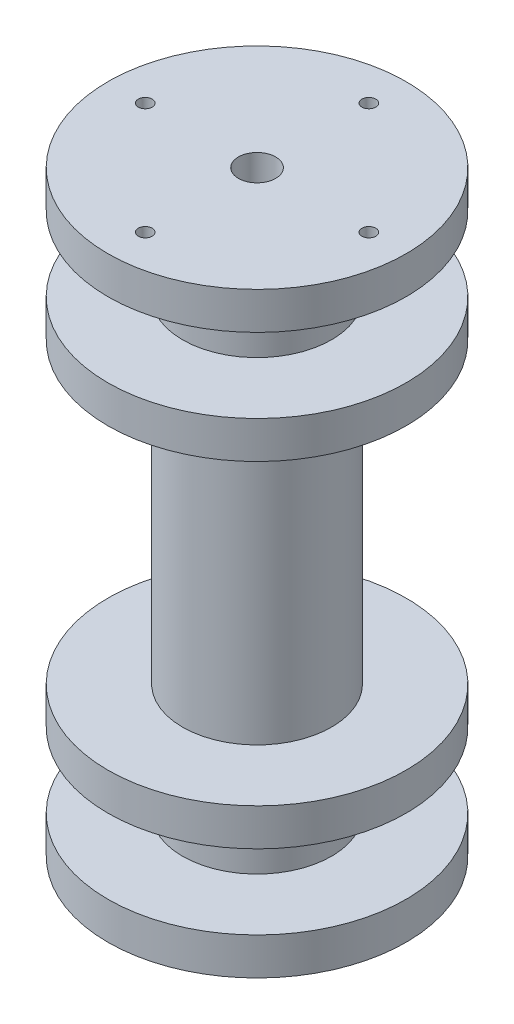
ISO-10303-21;
HEADER;
FILE_DESCRIPTION(('STEP AP214'),'2;1');
FILE_NAME('part.step','',(''),(''),'','','');
FILE_SCHEMA(('AUTOMOTIVE_DESIGN { 1 0 10303 214 1 1 1 1 }'));
ENDSEC;
DATA;
#1=APPLICATION_CONTEXT('core data for automotive mechanical design processes');
#2=APPLICATION_PROTOCOL_DEFINITION('international standard','automotive_design',2000,#1);
#3=PRODUCT_CONTEXT('',#1,'mechanical');
#4=PRODUCT('Part','Part','',(#3));
#5=PRODUCT_RELATED_PRODUCT_CATEGORY('part','',(#4));
#6=PRODUCT_DEFINITION_FORMATION('','',#4);
#7=PRODUCT_DEFINITION_CONTEXT('part definition',#1,'design');
#8=PRODUCT_DEFINITION('design','',#6,#7);
#9=PRODUCT_DEFINITION_SHAPE('','',#8);
#10=(LENGTH_UNIT() NAMED_UNIT(*) SI_UNIT(.MILLI.,.METRE.));
#11=(NAMED_UNIT(*) PLANE_ANGLE_UNIT() SI_UNIT($,.RADIAN.));
#12=(NAMED_UNIT(*) SI_UNIT($,.STERADIAN.) SOLID_ANGLE_UNIT());
#13=UNCERTAINTY_MEASURE_WITH_UNIT(LENGTH_MEASURE(1.E-05),#10,'distance_accuracy_value','');
#14=(GEOMETRIC_REPRESENTATION_CONTEXT(3) GLOBAL_UNCERTAINTY_ASSIGNED_CONTEXT((#13)) GLOBAL_UNIT_ASSIGNED_CONTEXT((#10,
#11,#12)) REPRESENTATION_CONTEXT('',''));
#15=CARTESIAN_POINT('',(0.,0.,0.));
#16=DIRECTION('',(0.,0.,1.));
#17=DIRECTION('',(1.,0.,0.));
#18=AXIS2_PLACEMENT_3D('',#15,#16,#17);
#19=CARTESIAN_POINT('',(0.,101.6,0.));
#20=DIRECTION('',(0.,-1.,0.));
#21=DIRECTION('',(0.,0.,-1.));
#22=AXIS2_PLACEMENT_3D('',#19,#20,#21);
#23=CYLINDRICAL_SURFACE('',#22,25.4);
#24=CARTESIAN_POINT('',(0.,19.05,0.));
#25=DIRECTION('',(0.,1.,0.));
#26=DIRECTION('',(0.,0.,1.));
#27=AXIS2_PLACEMENT_3D('',#24,#25,#26);
#28=CIRCLE('',#27,25.4);
#29=CARTESIAN_POINT('',(0.,19.05,25.4));
#30=VERTEX_POINT('',#29);
#31=EDGE_CURVE('E63',#30,#30,#28,.T.);
#32=ORIENTED_EDGE('',*,*,#31,.T.);
#33=EDGE_LOOP('',(#32));
#34=FACE_BOUND('',#33,.T.);
#35=CARTESIAN_POINT('',(0.,25.4,0.));
#36=DIRECTION('',(0.,1.,0.));
#37=DIRECTION('',(0.,0.,1.));
#38=AXIS2_PLACEMENT_3D('',#35,#36,#37);
#39=CIRCLE('',#38,25.4);
#40=CARTESIAN_POINT('',(0.,25.4,25.4));
#41=VERTEX_POINT('',#40);
#42=EDGE_CURVE('E66',#41,#41,#39,.T.);
#43=ORIENTED_EDGE('',*,*,#42,.F.);
#44=EDGE_LOOP('',(#43));
#45=FACE_BOUND('',#44,.T.);
#46=ADVANCED_FACE('F30',(#34,#45),#23,.T.);
#47=CARTESIAN_POINT('',(0.,6.35,-25.4));
#48=DIRECTION('',(0.,1.,0.));
#49=DIRECTION('',(0.,0.,1.));
#50=AXIS2_PLACEMENT_3D('',#47,#48,#49);
#51=PLANE('',#50);
#52=CARTESIAN_POINT('',(0.,6.34999999999999,0.));
#53=DIRECTION('',(0.,1.,0.));
#54=DIRECTION('',(0.,0.,1.));
#55=AXIS2_PLACEMENT_3D('',#52,#53,#54);
#56=CIRCLE('',#55,25.4);
#57=CARTESIAN_POINT('',(0.,6.34999999999999,25.4));
#58=VERTEX_POINT('',#57);
#59=EDGE_CURVE('E54',#58,#58,#56,.T.);
#60=ORIENTED_EDGE('',*,*,#59,.T.);
#61=EDGE_LOOP('',(#60));
#62=FACE_BOUND('',#61,.T.);
#63=CARTESIAN_POINT('',(0.,6.34999999999999,0.));
#64=DIRECTION('',(0.,1.,0.));
#65=DIRECTION('',(0.,0.,1.));
#66=AXIS2_PLACEMENT_3D('',#63,#64,#65);
#67=CIRCLE('',#66,12.7);
#68=CARTESIAN_POINT('',(0.,6.34999999999999,12.7));
#69=VERTEX_POINT('',#68);
#70=EDGE_CURVE('E57',#69,#69,#67,.T.);
#71=ORIENTED_EDGE('',*,*,#70,.F.);
#72=EDGE_LOOP('',(#71));
#73=FACE_BOUND('',#72,.T.);
#74=ADVANCED_FACE('F152',(#62,#73),#51,.T.);
#75=CARTESIAN_POINT('',(0.,101.6,0.));
#76=DIRECTION('',(0.,1.,0.));
#77=DIRECTION('',(0.,0.,1.));
#78=AXIS2_PLACEMENT_3D('',#75,#76,#77);
#79=CYLINDRICAL_SURFACE('',#78,12.7);
#80=ORIENTED_EDGE('',*,*,#70,.T.);
#81=EDGE_LOOP('',(#80));
#82=FACE_BOUND('',#81,.T.);
#83=CARTESIAN_POINT('',(0.,19.05,0.));
#84=DIRECTION('',(0.,1.,0.));
#85=DIRECTION('',(0.,0.,1.));
#86=AXIS2_PLACEMENT_3D('',#83,#84,#85);
#87=CIRCLE('',#86,12.7);
#88=CARTESIAN_POINT('',(0.,19.05,12.7));
#89=VERTEX_POINT('',#88);
#90=EDGE_CURVE('E60',#89,#89,#87,.T.);
#91=ORIENTED_EDGE('',*,*,#90,.F.);
#92=EDGE_LOOP('',(#91));
#93=FACE_BOUND('',#92,.T.);
#94=ADVANCED_FACE('F155',(#82,#93),#79,.T.);
#95=CARTESIAN_POINT('',(0.,19.05,-25.4));
#96=DIRECTION('',(0.,-1.,0.));
#97=DIRECTION('',(0.,0.,-1.));
#98=AXIS2_PLACEMENT_3D('',#95,#96,#97);
#99=PLANE('',#98);
#100=ORIENTED_EDGE('',*,*,#90,.T.);
#101=EDGE_LOOP('',(#100));
#102=FACE_BOUND('',#101,.T.);
#103=ORIENTED_EDGE('',*,*,#31,.F.);
#104=EDGE_LOOP('',(#103));
#105=FACE_BOUND('',#104,.T.);
#106=ADVANCED_FACE('F144',(#102,#105),#99,.T.);
#107=CARTESIAN_POINT('',(0.,0.,0.));
#108=DIRECTION('',(0.,1.,0.));
#109=DIRECTION('',(0.,0.,1.));
#110=AXIS2_PLACEMENT_3D('',#107,#108,#109);
#111=PLANE('',#110);
#112=CARTESIAN_POINT('',(0.,0.,0.));
#113=DIRECTION('',(0.,1.,0.));
#114=DIRECTION('',(0.,0.,1.));
#115=AXIS2_PLACEMENT_3D('',#112,#113,#114);
#116=CIRCLE('',#115,3.175);
#117=CARTESIAN_POINT('',(0.,0.,3.175));
#118=VERTEX_POINT('',#117);
#119=EDGE_CURVE('E78',#118,#118,#116,.F.);
#120=ORIENTED_EDGE('',*,*,#119,.F.);
#121=EDGE_LOOP('',(#120));
#122=FACE_BOUND('',#121,.T.);
#123=CARTESIAN_POINT('',(0.,0.,0.));
#124=DIRECTION('',(0.,1.,0.));
#125=DIRECTION('',(0.,0.,1.));
#126=AXIS2_PLACEMENT_3D('',#123,#124,#125);
#127=CIRCLE('',#126,25.4);
#128=CARTESIAN_POINT('',(0.,0.,25.4));
#129=VERTEX_POINT('',#128);
#130=EDGE_CURVE('E34',#129,#129,#127,.T.);
#131=ORIENTED_EDGE('',*,*,#130,.F.);
#132=EDGE_LOOP('',(#131));
#133=FACE_BOUND('',#132,.T.);
#134=ADVANCED_FACE('F141',(#122,#133),#111,.F.);
#135=ORIENTED_EDGE('',*,*,#130,.T.);
#136=EDGE_LOOP('',(#135));
#137=FACE_BOUND('',#136,.T.);
#138=ORIENTED_EDGE('',*,*,#59,.F.);
#139=EDGE_LOOP('',(#138));
#140=FACE_BOUND('',#139,.T.);
#141=ADVANCED_FACE('F32',(#137,#140),#23,.T.);
#142=CARTESIAN_POINT('',(0.,25.4,-25.4));
#143=DIRECTION('',(0.,1.,0.));
#144=DIRECTION('',(0.,0.,1.));
#145=AXIS2_PLACEMENT_3D('',#142,#143,#144);
#146=PLANE('',#145);
#147=ORIENTED_EDGE('',*,*,#42,.T.);
#148=EDGE_LOOP('',(#147));
#149=FACE_BOUND('',#148,.T.);
#150=CARTESIAN_POINT('',(0.,25.4,0.));
#151=DIRECTION('',(0.,1.,0.));
#152=DIRECTION('',(0.,0.,1.));
#153=AXIS2_PLACEMENT_3D('',#150,#151,#152);
#154=CIRCLE('',#153,12.7);
#155=CARTESIAN_POINT('',(0.,25.4,12.7));
#156=VERTEX_POINT('',#155);
#157=EDGE_CURVE('E69',#156,#156,#154,.T.);
#158=ORIENTED_EDGE('',*,*,#157,.F.);
#159=EDGE_LOOP('',(#158));
#160=FACE_BOUND('',#159,.T.);
#161=ADVANCED_FACE('F149',(#149,#160),#146,.T.);
#162=CARTESIAN_POINT('',(0.,101.6,0.));
#163=DIRECTION('',(0.,1.,0.));
#164=DIRECTION('',(0.,0.,1.));
#165=AXIS2_PLACEMENT_3D('',#162,#163,#164);
#166=CYLINDRICAL_SURFACE('',#165,12.7);
#167=ORIENTED_EDGE('',*,*,#157,.T.);
#168=EDGE_LOOP('',(#167));
#169=FACE_BOUND('',#168,.T.);
#170=CARTESIAN_POINT('',(0.,76.2,0.));
#171=DIRECTION('',(0.,1.,0.));
#172=DIRECTION('',(0.,0.,1.));
#173=AXIS2_PLACEMENT_3D('',#170,#171,#172);
#174=CIRCLE('',#173,12.7);
#175=CARTESIAN_POINT('',(0.,76.2,12.7));
#176=VERTEX_POINT('',#175);
#177=EDGE_CURVE('E72',#176,#176,#174,.T.);
#178=ORIENTED_EDGE('',*,*,#177,.F.);
#179=EDGE_LOOP('',(#178));
#180=FACE_BOUND('',#179,.T.);
#181=ADVANCED_FACE('F175',(#169,#180),#166,.T.);
#182=CARTESIAN_POINT('',(0.,76.2,-25.4));
#183=DIRECTION('',(0.,-1.,0.));
#184=DIRECTION('',(0.,0.,-1.));
#185=AXIS2_PLACEMENT_3D('',#182,#183,#184);
#186=PLANE('',#185);
#187=ORIENTED_EDGE('',*,*,#177,.T.);
#188=EDGE_LOOP('',(#187));
#189=FACE_BOUND('',#188,.T.);
#190=CARTESIAN_POINT('',(0.,76.2,0.));
#191=DIRECTION('',(0.,1.,0.));
#192=DIRECTION('',(0.,0.,1.));
#193=AXIS2_PLACEMENT_3D('',#190,#191,#192);
#194=CIRCLE('',#193,25.4);
#195=CARTESIAN_POINT('',(0.,76.2,25.4));
#196=VERTEX_POINT('',#195);
#197=EDGE_CURVE('E75',#196,#196,#194,.T.);
#198=ORIENTED_EDGE('',*,*,#197,.F.);
#199=EDGE_LOOP('',(#198));
#200=FACE_BOUND('',#199,.T.);
#201=ADVANCED_FACE('F123',(#189,#200),#186,.T.);
#202=CARTESIAN_POINT('',(0.,101.6,0.));
#203=DIRECTION('',(0.,1.,0.));
#204=DIRECTION('',(0.,0.,1.));
#205=AXIS2_PLACEMENT_3D('',#202,#203,#204);
#206=PLANE('',#205);
#207=CARTESIAN_POINT('',(-1.99538158514885E-13,101.6,19.05));
#208=DIRECTION('',(0.,1.,0.));
#209=DIRECTION('',(0.,0.,1.));
#210=AXIS2_PLACEMENT_3D('',#207,#208,#209);
#211=CIRCLE('',#210,1.18745);
#212=CARTESIAN_POINT('',(-1.99538158514885E-13,101.6,20.23745));
#213=VERTEX_POINT('',#212);
#214=EDGE_CURVE('E103',#213,#213,#211,.T.);
#215=ORIENTED_EDGE('',*,*,#214,.F.);
#216=EDGE_LOOP('',(#215));
#217=FACE_BOUND('',#216,.T.);
#218=CARTESIAN_POINT('',(19.05,101.6,1.33025439009923E-13));
#219=DIRECTION('',(0.,1.,0.));
#220=DIRECTION('',(0.,0.,1.));
#221=AXIS2_PLACEMENT_3D('',#218,#219,#220);
#222=CIRCLE('',#221,1.18745);
#223=CARTESIAN_POINT('',(19.05,101.6,1.18745000000013));
#224=VERTEX_POINT('',#223);
#225=EDGE_CURVE('E97',#224,#224,#222,.T.);
#226=ORIENTED_EDGE('',*,*,#225,.F.);
#227=EDGE_LOOP('',(#226));
#228=FACE_BOUND('',#227,.T.);
#229=CARTESIAN_POINT('',(0.,101.6,-19.05));
#230=DIRECTION('',(0.,1.,0.));
#231=DIRECTION('',(0.,0.,1.));
#232=AXIS2_PLACEMENT_3D('',#229,#230,#231);
#233=CIRCLE('',#232,1.18745);
#234=CARTESIAN_POINT('',(0.,101.6,-17.86255));
#235=VERTEX_POINT('',#234);
#236=EDGE_CURVE('E91',#235,#235,#233,.T.);
#237=ORIENTED_EDGE('',*,*,#236,.F.);
#238=EDGE_LOOP('',(#237));
#239=FACE_BOUND('',#238,.T.);
#240=CARTESIAN_POINT('',(-19.05,101.6,0.));
#241=DIRECTION('',(0.,1.,0.));
#242=DIRECTION('',(0.,0.,1.));
#243=AXIS2_PLACEMENT_3D('',#240,#241,#242);
#244=CIRCLE('',#243,1.18745);
#245=CARTESIAN_POINT('',(-19.05,101.6,1.18745));
#246=VERTEX_POINT('',#245);
#247=EDGE_CURVE('E85',#246,#246,#244,.T.);
#248=ORIENTED_EDGE('',*,*,#247,.F.);
#249=EDGE_LOOP('',(#248));
#250=FACE_BOUND('',#249,.T.);
#251=CARTESIAN_POINT('',(0.,101.6,0.));
#252=DIRECTION('',(0.,1.,0.));
#253=DIRECTION('',(0.,0.,1.));
#254=AXIS2_PLACEMENT_3D('',#251,#252,#253);
#255=CIRCLE('',#254,3.175);
#256=CARTESIAN_POINT('',(0.,101.6,3.175));
#257=VERTEX_POINT('',#256);
#258=EDGE_CURVE('E81',#257,#257,#255,.T.);
#259=ORIENTED_EDGE('',*,*,#258,.F.);
#260=EDGE_LOOP('',(#259));
#261=FACE_BOUND('',#260,.T.);
#262=CARTESIAN_POINT('',(0.,101.6,0.));
#263=DIRECTION('',(0.,1.,0.));
#264=DIRECTION('',(0.,0.,1.));
#265=AXIS2_PLACEMENT_3D('',#262,#263,#264);
#266=CIRCLE('',#265,25.4);
#267=CARTESIAN_POINT('',(0.,101.6,25.4));
#268=VERTEX_POINT('',#267);
#269=EDGE_CURVE('E10',#268,#268,#266,.T.);
#270=ORIENTED_EDGE('',*,*,#269,.T.);
#271=EDGE_LOOP('',(#270));
#272=FACE_BOUND('',#271,.T.);
#273=ADVANCED_FACE('F119',(#217,#228,#239,#250,#261,#272),#206,.T.);
#274=ORIENTED_EDGE('',*,*,#269,.F.);
#275=EDGE_LOOP('',(#274));
#276=FACE_BOUND('',#275,.T.);
#277=CARTESIAN_POINT('',(0.,95.25,0.));
#278=DIRECTION('',(0.,1.,0.));
#279=DIRECTION('',(0.,0.,1.));
#280=AXIS2_PLACEMENT_3D('',#277,#278,#279);
#281=CIRCLE('',#280,25.4);
#282=CARTESIAN_POINT('',(0.,95.25,25.4));
#283=VERTEX_POINT('',#282);
#284=EDGE_CURVE('E51',#283,#283,#281,.T.);
#285=ORIENTED_EDGE('',*,*,#284,.T.);
#286=EDGE_LOOP('',(#285));
#287=FACE_BOUND('',#286,.T.);
#288=ADVANCED_FACE('F122',(#276,#287),#23,.T.);
#289=CARTESIAN_POINT('',(0.,95.25,-25.4));
#290=DIRECTION('',(0.,-1.,0.));
#291=DIRECTION('',(0.,0.,-1.));
#292=AXIS2_PLACEMENT_3D('',#289,#290,#291);
#293=PLANE('',#292);
#294=CARTESIAN_POINT('',(-1.99538158514885E-13,95.25,19.05));
#295=DIRECTION('',(0.,-1.,0.));
#296=DIRECTION('',(0.,0.,-1.));
#297=AXIS2_PLACEMENT_3D('',#294,#295,#296);
#298=CIRCLE('',#297,1.18745);
#299=CARTESIAN_POINT('',(-1.99538158514885E-13,95.25,17.86255));
#300=VERTEX_POINT('',#299);
#301=EDGE_CURVE('E100',#300,#300,#298,.F.);
#302=ORIENTED_EDGE('',*,*,#301,.T.);
#303=EDGE_LOOP('',(#302));
#304=FACE_BOUND('',#303,.T.);
#305=CARTESIAN_POINT('',(19.05,95.25,1.33025439009923E-13));
#306=DIRECTION('',(0.,-1.,0.));
#307=DIRECTION('',(0.,0.,-1.));
#308=AXIS2_PLACEMENT_3D('',#305,#306,#307);
#309=CIRCLE('',#308,1.18745);
#310=CARTESIAN_POINT('',(19.05,95.25,-1.18744999999987));
#311=VERTEX_POINT('',#310);
#312=EDGE_CURVE('E94',#311,#311,#309,.F.);
#313=ORIENTED_EDGE('',*,*,#312,.T.);
#314=EDGE_LOOP('',(#313));
#315=FACE_BOUND('',#314,.T.);
#316=CARTESIAN_POINT('',(0.,95.25,-19.05));
#317=DIRECTION('',(0.,-1.,0.));
#318=DIRECTION('',(0.,0.,-1.));
#319=AXIS2_PLACEMENT_3D('',#316,#317,#318);
#320=CIRCLE('',#319,1.18745);
#321=CARTESIAN_POINT('',(0.,95.25,-20.23745));
#322=VERTEX_POINT('',#321);
#323=EDGE_CURVE('E88',#322,#322,#320,.F.);
#324=ORIENTED_EDGE('',*,*,#323,.T.);
#325=EDGE_LOOP('',(#324));
#326=FACE_BOUND('',#325,.T.);
#327=CARTESIAN_POINT('',(-19.05,95.25,0.));
#328=DIRECTION('',(0.,-1.,0.));
#329=DIRECTION('',(0.,0.,-1.));
#330=AXIS2_PLACEMENT_3D('',#327,#328,#329);
#331=CIRCLE('',#330,1.18745);
#332=CARTESIAN_POINT('',(-19.05,95.25,-1.18745));
#333=VERTEX_POINT('',#332);
#334=EDGE_CURVE('E84',#333,#333,#331,.F.);
#335=ORIENTED_EDGE('',*,*,#334,.T.);
#336=EDGE_LOOP('',(#335));
#337=FACE_BOUND('',#336,.T.);
#338=CARTESIAN_POINT('',(0.,95.25,0.));
#339=DIRECTION('',(0.,1.,0.));
#340=DIRECTION('',(0.,0.,1.));
#341=AXIS2_PLACEMENT_3D('',#338,#339,#340);
#342=CIRCLE('',#341,12.7);
#343=CARTESIAN_POINT('',(0.,95.25,12.7));
#344=VERTEX_POINT('',#343);
#345=EDGE_CURVE('E48',#344,#344,#342,.T.);
#346=ORIENTED_EDGE('',*,*,#345,.T.);
#347=EDGE_LOOP('',(#346));
#348=FACE_BOUND('',#347,.T.);
#349=ORIENTED_EDGE('',*,*,#284,.F.);
#350=EDGE_LOOP('',(#349));
#351=FACE_BOUND('',#350,.T.);
#352=ADVANCED_FACE('F109',(#304,#315,#326,#337,#348,#351),#293,.T.);
#353=CARTESIAN_POINT('',(0.,101.6,0.));
#354=DIRECTION('',(0.,1.,0.));
#355=DIRECTION('',(0.,0.,1.));
#356=AXIS2_PLACEMENT_3D('',#353,#354,#355);
#357=CYLINDRICAL_SURFACE('',#356,12.7);
#358=CARTESIAN_POINT('',(0.,82.55,0.));
#359=DIRECTION('',(0.,1.,0.));
#360=DIRECTION('',(0.,0.,1.));
#361=AXIS2_PLACEMENT_3D('',#358,#359,#360);
#362=CIRCLE('',#361,12.7);
#363=CARTESIAN_POINT('',(0.,82.55,12.7));
#364=VERTEX_POINT('',#363);
#365=EDGE_CURVE('E45',#364,#364,#362,.T.);
#366=ORIENTED_EDGE('',*,*,#365,.T.);
#367=EDGE_LOOP('',(#366));
#368=FACE_BOUND('',#367,.T.);
#369=ORIENTED_EDGE('',*,*,#345,.F.);
#370=EDGE_LOOP('',(#369));
#371=FACE_BOUND('',#370,.T.);
#372=ADVANCED_FACE('F195',(#368,#371),#357,.T.);
#373=CARTESIAN_POINT('',(0.,82.55,-25.4));
#374=DIRECTION('',(0.,1.,0.));
#375=DIRECTION('',(0.,0.,1.));
#376=AXIS2_PLACEMENT_3D('',#373,#374,#375);
#377=PLANE('',#376);
#378=CARTESIAN_POINT('',(0.,82.55,0.));
#379=DIRECTION('',(0.,1.,0.));
#380=DIRECTION('',(0.,0.,1.));
#381=AXIS2_PLACEMENT_3D('',#378,#379,#380);
#382=CIRCLE('',#381,25.4);
#383=CARTESIAN_POINT('',(0.,82.55,25.4));
#384=VERTEX_POINT('',#383);
#385=EDGE_CURVE('E41',#384,#384,#382,.T.);
#386=ORIENTED_EDGE('',*,*,#385,.T.);
#387=EDGE_LOOP('',(#386));
#388=FACE_BOUND('',#387,.T.);
#389=ORIENTED_EDGE('',*,*,#365,.F.);
#390=EDGE_LOOP('',(#389));
#391=FACE_BOUND('',#390,.T.);
#392=ADVANCED_FACE('F190',(#388,#391),#377,.T.);
#393=ORIENTED_EDGE('',*,*,#385,.F.);
#394=EDGE_LOOP('',(#393));
#395=FACE_BOUND('',#394,.T.);
#396=ORIENTED_EDGE('',*,*,#197,.T.);
#397=EDGE_LOOP('',(#396));
#398=FACE_BOUND('',#397,.T.);
#399=ADVANCED_FACE('F137',(#395,#398),#23,.T.);
#400=CARTESIAN_POINT('',(0.,-0.001000000000001,0.));
#401=DIRECTION('',(0.,1.,0.));
#402=DIRECTION('',(0.,0.,1.));
#403=AXIS2_PLACEMENT_3D('',#400,#401,#402);
#404=CYLINDRICAL_SURFACE('',#403,3.175);
#405=ORIENTED_EDGE('',*,*,#258,.T.);
#406=EDGE_LOOP('',(#405));
#407=FACE_BOUND('',#406,.T.);
#408=ORIENTED_EDGE('',*,*,#119,.T.);
#409=EDGE_LOOP('',(#408));
#410=FACE_BOUND('',#409,.T.);
#411=ADVANCED_FACE('F133',(#407,#410),#404,.F.);
#412=CARTESIAN_POINT('',(-19.05,-0.001000000000001,0.));
#413=DIRECTION('',(0.,1.,0.));
#414=DIRECTION('',(0.,0.,1.));
#415=AXIS2_PLACEMENT_3D('',#412,#413,#414);
#416=CYLINDRICAL_SURFACE('',#415,1.18745);
#417=ORIENTED_EDGE('',*,*,#334,.F.);
#418=EDGE_LOOP('',(#417));
#419=FACE_BOUND('',#418,.T.);
#420=ORIENTED_EDGE('',*,*,#247,.T.);
#421=EDGE_LOOP('',(#420));
#422=FACE_BOUND('',#421,.T.);
#423=ADVANCED_FACE('F136',(#419,#422),#416,.F.);
#424=CARTESIAN_POINT('',(0.,-0.001000000000001,-19.05));
#425=DIRECTION('',(0.,1.,0.));
#426=DIRECTION('',(0.,0.,1.));
#427=AXIS2_PLACEMENT_3D('',#424,#425,#426);
#428=CYLINDRICAL_SURFACE('',#427,1.18745);
#429=ORIENTED_EDGE('',*,*,#323,.F.);
#430=EDGE_LOOP('',(#429));
#431=FACE_BOUND('',#430,.T.);
#432=ORIENTED_EDGE('',*,*,#236,.T.);
#433=EDGE_LOOP('',(#432));
#434=FACE_BOUND('',#433,.T.);
#435=ADVANCED_FACE('F216',(#431,#434),#428,.F.);
#436=CARTESIAN_POINT('',(19.05,-0.001000000000001,1.33025439009923E-13));
#437=DIRECTION('',(0.,1.,0.));
#438=DIRECTION('',(0.,0.,1.));
#439=AXIS2_PLACEMENT_3D('',#436,#437,#438);
#440=CYLINDRICAL_SURFACE('',#439,1.18745);
#441=ORIENTED_EDGE('',*,*,#312,.F.);
#442=EDGE_LOOP('',(#441));
#443=FACE_BOUND('',#442,.T.);
#444=ORIENTED_EDGE('',*,*,#225,.T.);
#445=EDGE_LOOP('',(#444));
#446=FACE_BOUND('',#445,.T.);
#447=ADVANCED_FACE('F115',(#443,#446),#440,.F.);
#448=CARTESIAN_POINT('',(-1.99538158514885E-13,-0.001000000000001,19.05));
#449=DIRECTION('',(0.,1.,0.));
#450=DIRECTION('',(0.,0.,1.));
#451=AXIS2_PLACEMENT_3D('',#448,#449,#450);
#452=CYLINDRICAL_SURFACE('',#451,1.18745);
#453=ORIENTED_EDGE('',*,*,#301,.F.);
#454=EDGE_LOOP('',(#453));
#455=FACE_BOUND('',#454,.T.);
#456=ORIENTED_EDGE('',*,*,#214,.T.);
#457=EDGE_LOOP('',(#456));
#458=FACE_BOUND('',#457,.T.);
#459=ADVANCED_FACE('F112',(#455,#458),#452,.F.);
#460=CLOSED_SHELL('',(#46,#74,#94,#106,#134,#141,#161,#181,#201,#273,#288,#352,#372,#392,#399,
#411,#423,#435,#447,#459));
#461=MANIFOLD_SOLID_BREP('B2',#460);
#462=ADVANCED_BREP_SHAPE_REPRESENTATION('',(#18,#461),#14);
#463=SHAPE_DEFINITION_REPRESENTATION(#9,#462);
ENDSEC;
END-ISO-10303-21;
